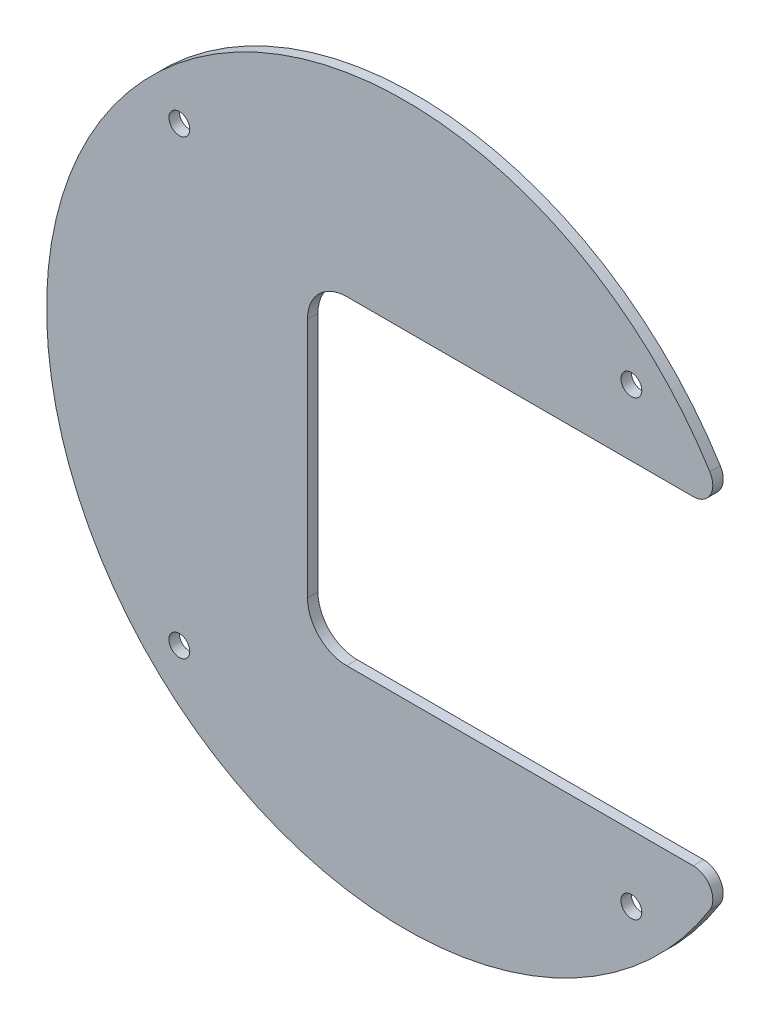
ISO-10303-21;
HEADER;
FILE_DESCRIPTION(('STEP AP214'),'2;1');
FILE_NAME('part.step','',(''),(''),'','','');
FILE_SCHEMA(('AUTOMOTIVE_DESIGN { 1 0 10303 214 1 1 1 1 }'));
ENDSEC;
DATA;
#1=APPLICATION_CONTEXT('core data for automotive mechanical design processes');
#2=APPLICATION_PROTOCOL_DEFINITION('international standard','automotive_design',2000,#1);
#3=PRODUCT_CONTEXT('',#1,'mechanical');
#4=PRODUCT('Part','Part','',(#3));
#5=PRODUCT_RELATED_PRODUCT_CATEGORY('part','',(#4));
#6=PRODUCT_DEFINITION_FORMATION('','',#4);
#7=PRODUCT_DEFINITION_CONTEXT('part definition',#1,'design');
#8=PRODUCT_DEFINITION('design','',#6,#7);
#9=PRODUCT_DEFINITION_SHAPE('','',#8);
#10=(LENGTH_UNIT() NAMED_UNIT(*) SI_UNIT(.MILLI.,.METRE.));
#11=(NAMED_UNIT(*) PLANE_ANGLE_UNIT() SI_UNIT($,.RADIAN.));
#12=(NAMED_UNIT(*) SI_UNIT($,.STERADIAN.) SOLID_ANGLE_UNIT());
#13=UNCERTAINTY_MEASURE_WITH_UNIT(LENGTH_MEASURE(1.E-05),#10,'distance_accuracy_value','');
#14=(GEOMETRIC_REPRESENTATION_CONTEXT(3) GLOBAL_UNCERTAINTY_ASSIGNED_CONTEXT((#13)) GLOBAL_UNIT_ASSIGNED_CONTEXT((#10,
#11,#12)) REPRESENTATION_CONTEXT('',''));
#15=CARTESIAN_POINT('',(0.,0.,0.));
#16=DIRECTION('',(0.,0.,1.));
#17=DIRECTION('',(1.,0.,0.));
#18=AXIS2_PLACEMENT_3D('',#15,#16,#17);
#19=CARTESIAN_POINT('',(0.,0.,1.6));
#20=DIRECTION('',(0.,0.,1.));
#21=DIRECTION('',(1.,0.,0.));
#22=AXIS2_PLACEMENT_3D('',#19,#20,#21);
#23=PLANE('',#22);
#24=CARTESIAN_POINT('',(-34.6482322781408,-34.6482322781408,1.6));
#25=DIRECTION('',(0.,0.,1.));
#26=DIRECTION('',(1.,0.,0.));
#27=AXIS2_PLACEMENT_3D('',#24,#25,#26);
#28=CIRCLE('',#27,1.6);
#29=CARTESIAN_POINT('',(-33.0482322781408,-34.6482322781408,1.6));
#30=VERTEX_POINT('',#29);
#31=EDGE_CURVE('E230',#30,#30,#28,.T.);
#32=ORIENTED_EDGE('',*,*,#31,.F.);
#33=EDGE_LOOP('',(#32));
#34=FACE_BOUND('',#33,.T.);
#35=CARTESIAN_POINT('',(34.6482322781408,34.6482322781408,1.6));
#36=DIRECTION('',(0.,0.,1.));
#37=DIRECTION('',(1.,0.,0.));
#38=AXIS2_PLACEMENT_3D('',#35,#36,#37);
#39=CIRCLE('',#38,1.6);
#40=CARTESIAN_POINT('',(36.2482322781408,34.6482322781408,1.6));
#41=VERTEX_POINT('',#40);
#42=EDGE_CURVE('E239',#41,#41,#39,.T.);
#43=ORIENTED_EDGE('',*,*,#42,.F.);
#44=EDGE_LOOP('',(#43));
#45=FACE_BOUND('',#44,.T.);
#46=DIRECTION('',(1.,0.,0.));
#47=VECTOR('',#46,1.);
#48=CARTESIAN_POINT('',(-15.,24.5,1.6));
#49=LINE('',#48,#47);
#50=CARTESIAN_POINT('',(-9.,24.5,1.6));
#51=VERTEX_POINT('',#50);
#52=CARTESIAN_POINT('',(44.1333207452147,24.5,1.6));
#53=VERTEX_POINT('',#52);
#54=EDGE_CURVE('E120',#51,#53,#49,.T.);
#55=ORIENTED_EDGE('',*,*,#54,.T.);
#56=CARTESIAN_POINT('',(44.1333207452147,27.5,1.6));
#57=DIRECTION('',(0.,0.,1.));
#58=DIRECTION('',(1.,0.,0.));
#59=AXIS2_PLACEMENT_3D('',#56,#57,#58);
#60=CIRCLE('',#59,3.);
#61=CARTESIAN_POINT('',(46.679473865131,29.0865384615385,1.6));
#62=VERTEX_POINT('',#61);
#63=EDGE_CURVE('E45',#53,#62,#60,.T.);
#64=ORIENTED_EDGE('',*,*,#63,.T.);
#65=CARTESIAN_POINT('',(0.,0.,1.6));
#66=DIRECTION('',(0.,0.,1.));
#67=DIRECTION('',(1.,0.,0.));
#68=AXIS2_PLACEMENT_3D('',#65,#66,#67);
#69=CIRCLE('',#68,55.);
#70=CARTESIAN_POINT('',(46.679473865131,-29.0865384615385,1.6));
#71=VERTEX_POINT('',#70);
#72=EDGE_CURVE('E127',#62,#71,#69,.T.);
#73=ORIENTED_EDGE('',*,*,#72,.T.);
#74=CARTESIAN_POINT('',(44.1333207452147,-27.5,1.6));
#75=DIRECTION('',(0.,0.,1.));
#76=DIRECTION('',(1.,0.,0.));
#77=AXIS2_PLACEMENT_3D('',#74,#75,#76);
#78=CIRCLE('',#77,3.);
#79=CARTESIAN_POINT('',(44.1333207452147,-24.5,1.6));
#80=VERTEX_POINT('',#79);
#81=EDGE_CURVE('E52',#71,#80,#78,.T.);
#82=ORIENTED_EDGE('',*,*,#81,.T.);
#83=DIRECTION('',(-1.,0.,0.));
#84=VECTOR('',#83,1.);
#85=CARTESIAN_POINT('',(49.2417505781425,-24.5,1.6));
#86=LINE('',#85,#84);
#87=CARTESIAN_POINT('',(-9.,-24.5,1.6));
#88=VERTEX_POINT('',#87);
#89=EDGE_CURVE('E130',#80,#88,#86,.T.);
#90=ORIENTED_EDGE('',*,*,#89,.T.);
#91=CARTESIAN_POINT('',(-9.,-18.5,1.6));
#92=DIRECTION('',(0.,0.,1.));
#93=DIRECTION('',(1.,0.,0.));
#94=AXIS2_PLACEMENT_3D('',#91,#92,#93);
#95=CIRCLE('',#94,6.);
#96=CARTESIAN_POINT('',(-15.,-18.5,1.6));
#97=VERTEX_POINT('',#96);
#98=EDGE_CURVE('E145',#88,#97,#95,.F.);
#99=ORIENTED_EDGE('',*,*,#98,.T.);
#100=DIRECTION('',(0.,1.,0.));
#101=VECTOR('',#100,1.);
#102=CARTESIAN_POINT('',(-15.,-24.5,1.6));
#103=LINE('',#102,#101);
#104=CARTESIAN_POINT('',(-15.,18.5,1.6));
#105=VERTEX_POINT('',#104);
#106=EDGE_CURVE('E246',#97,#105,#103,.T.);
#107=ORIENTED_EDGE('',*,*,#106,.T.);
#108=CARTESIAN_POINT('',(-9.,18.5,1.6));
#109=DIRECTION('',(0.,0.,1.));
#110=DIRECTION('',(1.,0.,0.));
#111=AXIS2_PLACEMENT_3D('',#108,#109,#110);
#112=CIRCLE('',#111,6.);
#113=EDGE_CURVE('E115',#105,#51,#112,.F.);
#114=ORIENTED_EDGE('',*,*,#113,.T.);
#115=EDGE_LOOP('',(#55,#64,#73,#82,#90,#99,#107,#114));
#116=FACE_BOUND('',#115,.T.);
#117=CARTESIAN_POINT('',(-34.6482322781408,34.6482322781408,1.6));
#118=DIRECTION('',(0.,0.,1.));
#119=DIRECTION('',(1.,0.,0.));
#120=AXIS2_PLACEMENT_3D('',#117,#118,#119);
#121=CIRCLE('',#120,1.6);
#122=CARTESIAN_POINT('',(-33.0482322781408,34.6482322781408,1.6));
#123=VERTEX_POINT('',#122);
#124=EDGE_CURVE('E225',#123,#123,#121,.T.);
#125=ORIENTED_EDGE('',*,*,#124,.F.);
#126=EDGE_LOOP('',(#125));
#127=FACE_BOUND('',#126,.T.);
#128=CARTESIAN_POINT('',(34.6482322781408,-34.6482322781408,1.6));
#129=DIRECTION('',(0.,0.,1.));
#130=DIRECTION('',(1.,0.,0.));
#131=AXIS2_PLACEMENT_3D('',#128,#129,#130);
#132=CIRCLE('',#131,1.6);
#133=CARTESIAN_POINT('',(36.2482322781408,-34.6482322781408,1.6));
#134=VERTEX_POINT('',#133);
#135=EDGE_CURVE('E265',#134,#134,#132,.T.);
#136=ORIENTED_EDGE('',*,*,#135,.F.);
#137=EDGE_LOOP('',(#136));
#138=FACE_BOUND('',#137,.T.);
#139=ADVANCED_FACE('F37',(#34,#45,#116,#127,#138),#23,.T.);
#140=CARTESIAN_POINT('',(0.,0.,0.));
#141=DIRECTION('',(0.,0.,1.));
#142=DIRECTION('',(1.,0.,0.));
#143=AXIS2_PLACEMENT_3D('',#140,#141,#142);
#144=PLANE('',#143);
#145=CARTESIAN_POINT('',(0.,0.,0.));
#146=DIRECTION('',(0.,0.,1.));
#147=DIRECTION('',(1.,0.,0.));
#148=AXIS2_PLACEMENT_3D('',#145,#146,#147);
#149=CIRCLE('',#148,55.);
#150=CARTESIAN_POINT('',(46.679473865131,29.0865384615385,0.));
#151=VERTEX_POINT('',#150);
#152=CARTESIAN_POINT('',(46.679473865131,-29.0865384615385,0.));
#153=VERTEX_POINT('',#152);
#154=EDGE_CURVE('E242',#151,#153,#149,.T.);
#155=ORIENTED_EDGE('',*,*,#154,.F.);
#156=CARTESIAN_POINT('',(44.1333207452147,27.5,0.));
#157=DIRECTION('',(0.,0.,1.));
#158=DIRECTION('',(1.,0.,0.));
#159=AXIS2_PLACEMENT_3D('',#156,#157,#158);
#160=CIRCLE('',#159,3.);
#161=CARTESIAN_POINT('',(44.1333207452147,24.5,0.));
#162=VERTEX_POINT('',#161);
#163=EDGE_CURVE('E126',#151,#162,#160,.F.);
#164=ORIENTED_EDGE('',*,*,#163,.T.);
#165=DIRECTION('',(1.,0.,0.));
#166=VECTOR('',#165,1.);
#167=CARTESIAN_POINT('',(-15.,24.5,0.));
#168=LINE('',#167,#166);
#169=CARTESIAN_POINT('',(-9.,24.5,0.));
#170=VERTEX_POINT('',#169);
#171=EDGE_CURVE('E119',#170,#162,#168,.T.);
#172=ORIENTED_EDGE('',*,*,#171,.F.);
#173=CARTESIAN_POINT('',(-9.,18.5,0.));
#174=DIRECTION('',(0.,0.,1.));
#175=DIRECTION('',(1.,0.,0.));
#176=AXIS2_PLACEMENT_3D('',#173,#174,#175);
#177=CIRCLE('',#176,6.);
#178=CARTESIAN_POINT('',(-15.,18.5,0.));
#179=VERTEX_POINT('',#178);
#180=EDGE_CURVE('E105',#170,#179,#177,.T.);
#181=ORIENTED_EDGE('',*,*,#180,.T.);
#182=DIRECTION('',(0.,1.,0.));
#183=VECTOR('',#182,1.);
#184=CARTESIAN_POINT('',(-15.,-24.5,0.));
#185=LINE('',#184,#183);
#186=CARTESIAN_POINT('',(-15.,-18.5,0.));
#187=VERTEX_POINT('',#186);
#188=EDGE_CURVE('E128',#187,#179,#185,.T.);
#189=ORIENTED_EDGE('',*,*,#188,.F.);
#190=CARTESIAN_POINT('',(-9.,-18.5,0.));
#191=DIRECTION('',(0.,0.,1.));
#192=DIRECTION('',(1.,0.,0.));
#193=AXIS2_PLACEMENT_3D('',#190,#191,#192);
#194=CIRCLE('',#193,6.);
#195=CARTESIAN_POINT('',(-9.,-24.5,0.));
#196=VERTEX_POINT('',#195);
#197=EDGE_CURVE('E142',#187,#196,#194,.T.);
#198=ORIENTED_EDGE('',*,*,#197,.T.);
#199=DIRECTION('',(-1.,0.,0.));
#200=VECTOR('',#199,1.);
#201=CARTESIAN_POINT('',(49.2417505781425,-24.5,0.));
#202=LINE('',#201,#200);
#203=CARTESIAN_POINT('',(44.1333207452147,-24.5,0.));
#204=VERTEX_POINT('',#203);
#205=EDGE_CURVE('E132',#204,#196,#202,.T.);
#206=ORIENTED_EDGE('',*,*,#205,.F.);
#207=CARTESIAN_POINT('',(44.1333207452147,-27.5,0.));
#208=DIRECTION('',(0.,0.,1.));
#209=DIRECTION('',(1.,0.,0.));
#210=AXIS2_PLACEMENT_3D('',#207,#208,#209);
#211=CIRCLE('',#210,3.);
#212=EDGE_CURVE('E152',#204,#153,#211,.F.);
#213=ORIENTED_EDGE('',*,*,#212,.T.);
#214=EDGE_LOOP('',(#155,#164,#172,#181,#189,#198,#206,#213));
#215=FACE_BOUND('',#214,.T.);
#216=CARTESIAN_POINT('',(34.6482322781408,34.6482322781408,0.));
#217=DIRECTION('',(0.,0.,1.));
#218=DIRECTION('',(1.,0.,0.));
#219=AXIS2_PLACEMENT_3D('',#216,#217,#218);
#220=CIRCLE('',#219,1.6);
#221=CARTESIAN_POINT('',(36.2482322781408,34.6482322781408,0.));
#222=VERTEX_POINT('',#221);
#223=EDGE_CURVE('E232',#222,#222,#220,.T.);
#224=ORIENTED_EDGE('',*,*,#223,.T.);
#225=EDGE_LOOP('',(#224));
#226=FACE_BOUND('',#225,.T.);
#227=CARTESIAN_POINT('',(-34.6482322781408,34.6482322781408,0.));
#228=DIRECTION('',(0.,0.,1.));
#229=DIRECTION('',(1.,0.,0.));
#230=AXIS2_PLACEMENT_3D('',#227,#228,#229);
#231=CIRCLE('',#230,1.6);
#232=CARTESIAN_POINT('',(-33.0482322781408,34.6482322781408,0.));
#233=VERTEX_POINT('',#232);
#234=EDGE_CURVE('E228',#233,#233,#231,.T.);
#235=ORIENTED_EDGE('',*,*,#234,.T.);
#236=EDGE_LOOP('',(#235));
#237=FACE_BOUND('',#236,.T.);
#238=CARTESIAN_POINT('',(-34.6482322781408,-34.6482322781408,0.));
#239=DIRECTION('',(0.,0.,1.));
#240=DIRECTION('',(1.,0.,0.));
#241=AXIS2_PLACEMENT_3D('',#238,#239,#240);
#242=CIRCLE('',#241,1.6);
#243=CARTESIAN_POINT('',(-33.0482322781408,-34.6482322781408,0.));
#244=VERTEX_POINT('',#243);
#245=EDGE_CURVE('E235',#244,#244,#242,.T.);
#246=ORIENTED_EDGE('',*,*,#245,.T.);
#247=EDGE_LOOP('',(#246));
#248=FACE_BOUND('',#247,.T.);
#249=CARTESIAN_POINT('',(34.6482322781408,-34.6482322781408,0.));
#250=DIRECTION('',(0.,0.,1.));
#251=DIRECTION('',(1.,0.,0.));
#252=AXIS2_PLACEMENT_3D('',#249,#250,#251);
#253=CIRCLE('',#252,1.6);
#254=CARTESIAN_POINT('',(36.2482322781408,-34.6482322781408,0.));
#255=VERTEX_POINT('',#254);
#256=EDGE_CURVE('E264',#255,#255,#253,.T.);
#257=ORIENTED_EDGE('',*,*,#256,.T.);
#258=EDGE_LOOP('',(#257));
#259=FACE_BOUND('',#258,.T.);
#260=ADVANCED_FACE('F124',(#215,#226,#237,#248,#259),#144,.F.);
#261=CARTESIAN_POINT('',(0.,0.,1.6));
#262=DIRECTION('',(0.,0.,-1.));
#263=DIRECTION('',(-1.,0.,0.));
#264=AXIS2_PLACEMENT_3D('',#261,#262,#263);
#265=CYLINDRICAL_SURFACE('',#264,55.);
#266=ORIENTED_EDGE('',*,*,#72,.F.);
#267=DIRECTION('',(0.,0.,-1.));
#268=VECTOR('',#267,1.);
#269=CARTESIAN_POINT('',(46.679473865131,29.0865384615385,1.6));
#270=LINE('',#269,#268);
#271=EDGE_CURVE('E149',#62,#151,#270,.T.);
#272=ORIENTED_EDGE('',*,*,#271,.T.);
#273=ORIENTED_EDGE('',*,*,#154,.T.);
#274=DIRECTION('',(0.,0.,-1.));
#275=VECTOR('',#274,1.);
#276=CARTESIAN_POINT('',(46.679473865131,-29.0865384615385,1.6));
#277=LINE('',#276,#275);
#278=EDGE_CURVE('E147',#153,#71,#277,.F.);
#279=ORIENTED_EDGE('',*,*,#278,.T.);
#280=EDGE_LOOP('',(#266,#272,#273,#279));
#281=FACE_BOUND('',#280,.T.);
#282=ADVANCED_FACE('F162',(#281),#265,.T.);
#283=CARTESIAN_POINT('',(49.2417505781425,-24.5,1.6));
#284=DIRECTION('',(0.,-1.,0.));
#285=DIRECTION('',(0.,0.,-1.));
#286=AXIS2_PLACEMENT_3D('',#283,#284,#285);
#287=PLANE('',#286);
#288=ORIENTED_EDGE('',*,*,#89,.F.);
#289=DIRECTION('',(0.,0.,-1.));
#290=VECTOR('',#289,1.);
#291=CARTESIAN_POINT('',(44.1333207452147,-24.5,1.6));
#292=LINE('',#291,#290);
#293=EDGE_CURVE('E11',#80,#204,#292,.T.);
#294=ORIENTED_EDGE('',*,*,#293,.T.);
#295=ORIENTED_EDGE('',*,*,#205,.T.);
#296=DIRECTION('',(0.,0.,-1.));
#297=VECTOR('',#296,1.);
#298=CARTESIAN_POINT('',(-9.,-24.5,1.6));
#299=LINE('',#298,#297);
#300=EDGE_CURVE('E116',#196,#88,#299,.F.);
#301=ORIENTED_EDGE('',*,*,#300,.T.);
#302=EDGE_LOOP('',(#288,#294,#295,#301));
#303=FACE_BOUND('',#302,.T.);
#304=ADVANCED_FACE('F193',(#303),#287,.F.);
#305=CARTESIAN_POINT('',(-15.,-24.5,1.6));
#306=DIRECTION('',(-1.,0.,0.));
#307=DIRECTION('',(0.,0.,1.));
#308=AXIS2_PLACEMENT_3D('',#305,#306,#307);
#309=PLANE('',#308);
#310=ORIENTED_EDGE('',*,*,#188,.T.);
#311=DIRECTION('',(0.,0.,-1.));
#312=VECTOR('',#311,1.);
#313=CARTESIAN_POINT('',(-15.,18.5,1.6));
#314=LINE('',#313,#312);
#315=EDGE_CURVE('E110',#179,#105,#314,.F.);
#316=ORIENTED_EDGE('',*,*,#315,.T.);
#317=ORIENTED_EDGE('',*,*,#106,.F.);
#318=DIRECTION('',(0.,0.,-1.));
#319=VECTOR('',#318,1.);
#320=CARTESIAN_POINT('',(-15.,-18.5,0.));
#321=LINE('',#320,#319);
#322=EDGE_CURVE('E121',#97,#187,#321,.T.);
#323=ORIENTED_EDGE('',*,*,#322,.T.);
#324=EDGE_LOOP('',(#310,#316,#317,#323));
#325=FACE_BOUND('',#324,.T.);
#326=ADVANCED_FACE('F190',(#325),#309,.F.);
#327=CARTESIAN_POINT('',(-15.,24.5,1.6));
#328=DIRECTION('',(0.,1.,0.));
#329=DIRECTION('',(0.,0.,1.));
#330=AXIS2_PLACEMENT_3D('',#327,#328,#329);
#331=PLANE('',#330);
#332=ORIENTED_EDGE('',*,*,#171,.T.);
#333=DIRECTION('',(0.,0.,-1.));
#334=VECTOR('',#333,1.);
#335=CARTESIAN_POINT('',(44.1333207452147,24.5,1.6));
#336=LINE('',#335,#334);
#337=EDGE_CURVE('E60',#162,#53,#336,.F.);
#338=ORIENTED_EDGE('',*,*,#337,.T.);
#339=ORIENTED_EDGE('',*,*,#54,.F.);
#340=DIRECTION('',(0.,0.,-1.));
#341=VECTOR('',#340,1.);
#342=CARTESIAN_POINT('',(-9.,24.5,0.));
#343=LINE('',#342,#341);
#344=EDGE_CURVE('E109',#51,#170,#343,.T.);
#345=ORIENTED_EDGE('',*,*,#344,.T.);
#346=EDGE_LOOP('',(#332,#338,#339,#345));
#347=FACE_BOUND('',#346,.T.);
#348=ADVANCED_FACE('F118',(#347),#331,.F.);
#349=CARTESIAN_POINT('',(34.6482322781408,34.6482322781408,1.6));
#350=DIRECTION('',(0.,0.,-1.));
#351=DIRECTION('',(-1.,0.,0.));
#352=AXIS2_PLACEMENT_3D('',#349,#350,#351);
#353=CYLINDRICAL_SURFACE('',#352,1.6);
#354=ORIENTED_EDGE('',*,*,#42,.T.);
#355=EDGE_LOOP('',(#354));
#356=FACE_BOUND('',#355,.T.);
#357=ORIENTED_EDGE('',*,*,#223,.F.);
#358=EDGE_LOOP('',(#357));
#359=FACE_BOUND('',#358,.T.);
#360=ADVANCED_FACE('F185',(#356,#359),#353,.F.);
#361=CARTESIAN_POINT('',(-34.6482322781408,34.6482322781408,1.6));
#362=DIRECTION('',(0.,0.,-1.));
#363=DIRECTION('',(-1.,0.,0.));
#364=AXIS2_PLACEMENT_3D('',#361,#362,#363);
#365=CYLINDRICAL_SURFACE('',#364,1.6);
#366=ORIENTED_EDGE('',*,*,#124,.T.);
#367=EDGE_LOOP('',(#366));
#368=FACE_BOUND('',#367,.T.);
#369=ORIENTED_EDGE('',*,*,#234,.F.);
#370=EDGE_LOOP('',(#369));
#371=FACE_BOUND('',#370,.T.);
#372=ADVANCED_FACE('F211',(#368,#371),#365,.F.);
#373=CARTESIAN_POINT('',(-34.6482322781408,-34.6482322781408,1.6));
#374=DIRECTION('',(0.,0.,-1.));
#375=DIRECTION('',(-1.,0.,0.));
#376=AXIS2_PLACEMENT_3D('',#373,#374,#375);
#377=CYLINDRICAL_SURFACE('',#376,1.6);
#378=ORIENTED_EDGE('',*,*,#31,.T.);
#379=EDGE_LOOP('',(#378));
#380=FACE_BOUND('',#379,.T.);
#381=ORIENTED_EDGE('',*,*,#245,.F.);
#382=EDGE_LOOP('',(#381));
#383=FACE_BOUND('',#382,.T.);
#384=ADVANCED_FACE('F205',(#380,#383),#377,.F.);
#385=CARTESIAN_POINT('',(34.6482322781408,-34.6482322781408,1.6));
#386=DIRECTION('',(0.,0.,-1.));
#387=DIRECTION('',(-1.,0.,0.));
#388=AXIS2_PLACEMENT_3D('',#385,#386,#387);
#389=CYLINDRICAL_SURFACE('',#388,1.6);
#390=ORIENTED_EDGE('',*,*,#135,.T.);
#391=EDGE_LOOP('',(#390));
#392=FACE_BOUND('',#391,.T.);
#393=ORIENTED_EDGE('',*,*,#256,.F.);
#394=EDGE_LOOP('',(#393));
#395=FACE_BOUND('',#394,.T.);
#396=ADVANCED_FACE('F201',(#392,#395),#389,.F.);
#397=CARTESIAN_POINT('',(-9.,18.5,1.6));
#398=DIRECTION('',(0.,0.,1.));
#399=DIRECTION('',(1.,0.,0.));
#400=AXIS2_PLACEMENT_3D('',#397,#398,#399);
#401=CYLINDRICAL_SURFACE('',#400,6.);
#402=ORIENTED_EDGE('',*,*,#113,.F.);
#403=ORIENTED_EDGE('',*,*,#315,.F.);
#404=ORIENTED_EDGE('',*,*,#180,.F.);
#405=ORIENTED_EDGE('',*,*,#344,.F.);
#406=EDGE_LOOP('',(#402,#403,#404,#405));
#407=FACE_BOUND('',#406,.T.);
#408=ADVANCED_FACE('F108',(#407),#401,.F.);
#409=CARTESIAN_POINT('',(-9.,-18.5,1.6));
#410=DIRECTION('',(0.,0.,1.));
#411=DIRECTION('',(1.,0.,0.));
#412=AXIS2_PLACEMENT_3D('',#409,#410,#411);
#413=CYLINDRICAL_SURFACE('',#412,6.);
#414=ORIENTED_EDGE('',*,*,#98,.F.);
#415=ORIENTED_EDGE('',*,*,#300,.F.);
#416=ORIENTED_EDGE('',*,*,#197,.F.);
#417=ORIENTED_EDGE('',*,*,#322,.F.);
#418=EDGE_LOOP('',(#414,#415,#416,#417));
#419=FACE_BOUND('',#418,.T.);
#420=ADVANCED_FACE('F167',(#419),#413,.F.);
#421=CARTESIAN_POINT('',(44.1333207452147,27.5,1.6));
#422=DIRECTION('',(0.,0.,-1.));
#423=DIRECTION('',(-1.,0.,0.));
#424=AXIS2_PLACEMENT_3D('',#421,#422,#423);
#425=CYLINDRICAL_SURFACE('',#424,3.);
#426=ORIENTED_EDGE('',*,*,#63,.F.);
#427=ORIENTED_EDGE('',*,*,#337,.F.);
#428=ORIENTED_EDGE('',*,*,#163,.F.);
#429=ORIENTED_EDGE('',*,*,#271,.F.);
#430=EDGE_LOOP('',(#426,#427,#428,#429));
#431=FACE_BOUND('',#430,.T.);
#432=ADVANCED_FACE('F165',(#431),#425,.T.);
#433=CARTESIAN_POINT('',(44.1333207452147,-27.5,1.6));
#434=DIRECTION('',(0.,0.,-1.));
#435=DIRECTION('',(-1.,0.,0.));
#436=AXIS2_PLACEMENT_3D('',#433,#434,#435);
#437=CYLINDRICAL_SURFACE('',#436,3.);
#438=ORIENTED_EDGE('',*,*,#81,.F.);
#439=ORIENTED_EDGE('',*,*,#278,.F.);
#440=ORIENTED_EDGE('',*,*,#212,.F.);
#441=ORIENTED_EDGE('',*,*,#293,.F.);
#442=EDGE_LOOP('',(#438,#439,#440,#441));
#443=FACE_BOUND('',#442,.T.);
#444=ADVANCED_FACE('F39',(#443),#437,.T.);
#445=CLOSED_SHELL('',(#139,#260,#282,#304,#326,#348,#360,#372,#384,#396,#408,#420,#432,#444));
#446=MANIFOLD_SOLID_BREP('B2',#445);
#447=ADVANCED_BREP_SHAPE_REPRESENTATION('',(#18,#446),#14);
#448=SHAPE_DEFINITION_REPRESENTATION(#9,#447);
ENDSEC;
END-ISO-10303-21;
